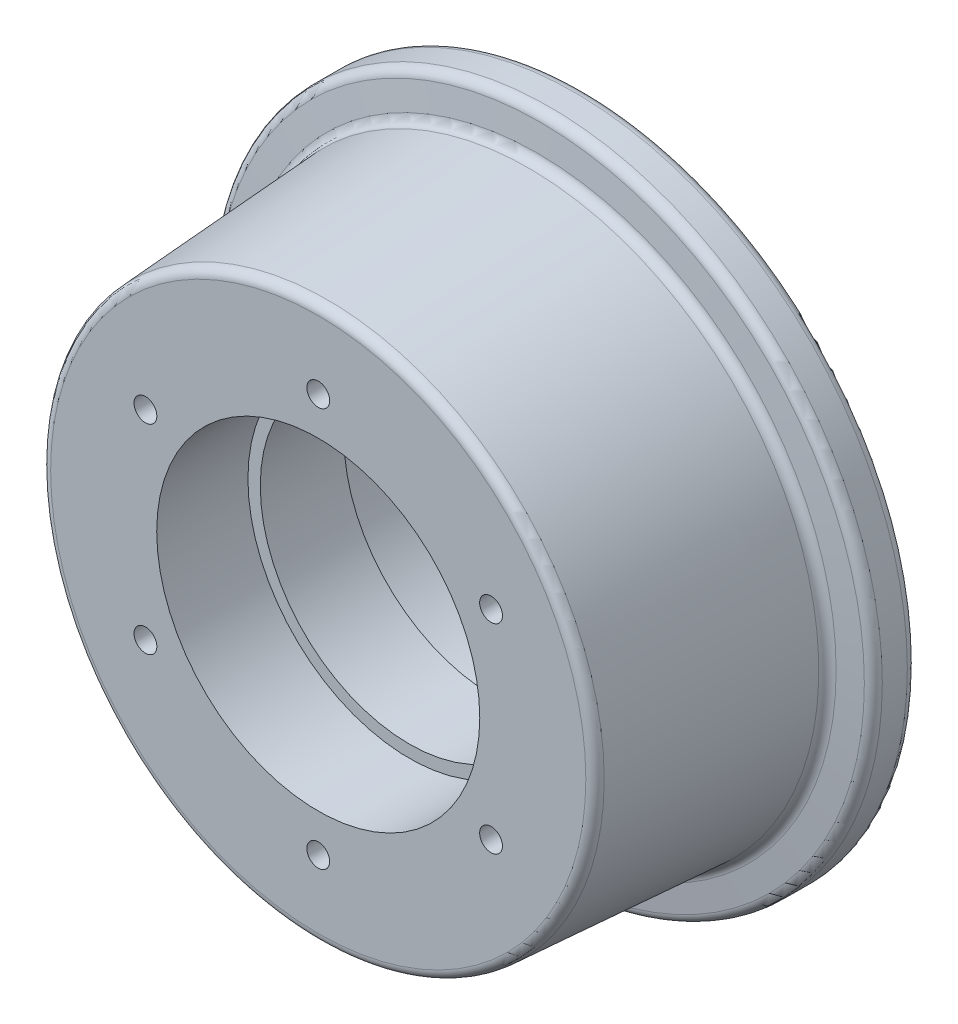
ISO-10303-21;
HEADER;
FILE_DESCRIPTION(('STEP AP214'),'2;1');
FILE_NAME('part.step','',(''),(''),'','','');
FILE_SCHEMA(('AUTOMOTIVE_DESIGN { 1 0 10303 214 1 1 1 1 }'));
ENDSEC;
DATA;
#1=APPLICATION_CONTEXT('core data for automotive mechanical design processes');
#2=APPLICATION_PROTOCOL_DEFINITION('international standard','automotive_design',2000,#1);
#3=PRODUCT_CONTEXT('',#1,'mechanical');
#4=PRODUCT('Part','Part','',(#3));
#5=PRODUCT_RELATED_PRODUCT_CATEGORY('part','',(#4));
#6=PRODUCT_DEFINITION_FORMATION('','',#4);
#7=PRODUCT_DEFINITION_CONTEXT('part definition',#1,'design');
#8=PRODUCT_DEFINITION('design','',#6,#7);
#9=PRODUCT_DEFINITION_SHAPE('','',#8);
#10=(LENGTH_UNIT() NAMED_UNIT(*) SI_UNIT(.MILLI.,.METRE.));
#11=(NAMED_UNIT(*) PLANE_ANGLE_UNIT() SI_UNIT($,.RADIAN.));
#12=(NAMED_UNIT(*) SI_UNIT($,.STERADIAN.) SOLID_ANGLE_UNIT());
#13=UNCERTAINTY_MEASURE_WITH_UNIT(LENGTH_MEASURE(1.E-05),#10,'distance_accuracy_value','');
#14=(GEOMETRIC_REPRESENTATION_CONTEXT(3) GLOBAL_UNCERTAINTY_ASSIGNED_CONTEXT((#13)) GLOBAL_UNIT_ASSIGNED_CONTEXT((#10,
#11,#12)) REPRESENTATION_CONTEXT('',''));
#15=CARTESIAN_POINT('',(0.,0.,0.));
#16=DIRECTION('',(0.,0.,1.));
#17=DIRECTION('',(1.,0.,0.));
#18=AXIS2_PLACEMENT_3D('',#15,#16,#17);
#19=CARTESIAN_POINT('',(0.,78.5,22.));
#20=DIRECTION('',(0.,0.,-1.));
#21=DIRECTION('',(-1.,0.,0.));
#22=AXIS2_PLACEMENT_3D('',#19,#20,#21);
#23=PLANE('',#22);
#24=CARTESIAN_POINT('',(0.,0.,22.));
#25=DIRECTION('',(0.,0.,1.));
#26=DIRECTION('',(1.,0.,0.));
#27=AXIS2_PLACEMENT_3D('',#24,#25,#26);
#28=CIRCLE('',#27,78.5);
#29=CARTESIAN_POINT('',(78.5,0.,22.));
#30=VERTEX_POINT('',#29);
#31=EDGE_CURVE('E64',#30,#30,#28,.T.);
#32=ORIENTED_EDGE('',*,*,#31,.F.);
#33=EDGE_LOOP('',(#32));
#34=FACE_BOUND('',#33,.T.);
#35=CARTESIAN_POINT('',(0.,0.,22.));
#36=DIRECTION('',(0.,0.,1.));
#37=DIRECTION('',(1.,0.,0.));
#38=AXIS2_PLACEMENT_3D('',#35,#36,#37);
#39=CIRCLE('',#38,85.);
#40=CARTESIAN_POINT('',(85.,0.,22.));
#41=VERTEX_POINT('',#40);
#42=EDGE_CURVE('E85',#41,#41,#39,.T.);
#43=ORIENTED_EDGE('',*,*,#42,.T.);
#44=EDGE_LOOP('',(#43));
#45=FACE_BOUND('',#44,.T.);
#46=ADVANCED_FACE('F32',(#34,#45),#23,.F.);
#47=CARTESIAN_POINT('',(0.,0.,1000.));
#48=DIRECTION('',(0.,0.,1.));
#49=DIRECTION('',(1.,0.,0.));
#50=AXIS2_PLACEMENT_3D('',#47,#48,#49);
#51=CYLINDRICAL_SURFACE('',#50,78.5);
#52=CARTESIAN_POINT('',(0.,0.,-22.));
#53=DIRECTION('',(0.,0.,1.));
#54=DIRECTION('',(1.,0.,0.));
#55=AXIS2_PLACEMENT_3D('',#52,#53,#54);
#56=CIRCLE('',#55,78.5);
#57=CARTESIAN_POINT('',(78.5,0.,-22.));
#58=VERTEX_POINT('',#57);
#59=EDGE_CURVE('E67',#58,#58,#56,.T.);
#60=ORIENTED_EDGE('',*,*,#59,.F.);
#61=EDGE_LOOP('',(#60));
#62=FACE_BOUND('',#61,.T.);
#63=ORIENTED_EDGE('',*,*,#31,.T.);
#64=EDGE_LOOP('',(#63));
#65=FACE_BOUND('',#64,.T.);
#66=ADVANCED_FACE('F201',(#62,#65),#51,.F.);
#67=CARTESIAN_POINT('',(0.,78.5,-22.));
#68=DIRECTION('',(0.,0.,1.));
#69=DIRECTION('',(1.,0.,0.));
#70=AXIS2_PLACEMENT_3D('',#67,#68,#69);
#71=PLANE('',#70);
#72=CARTESIAN_POINT('',(0.,0.,-22.));
#73=DIRECTION('',(0.,0.,1.));
#74=DIRECTION('',(1.,0.,0.));
#75=AXIS2_PLACEMENT_3D('',#72,#73,#74);
#76=CIRCLE('',#75,85.);
#77=CARTESIAN_POINT('',(85.,0.,-22.));
#78=VERTEX_POINT('',#77);
#79=EDGE_CURVE('E70',#78,#78,#76,.T.);
#80=ORIENTED_EDGE('',*,*,#79,.F.);
#81=EDGE_LOOP('',(#80));
#82=FACE_BOUND('',#81,.T.);
#83=ORIENTED_EDGE('',*,*,#59,.T.);
#84=EDGE_LOOP('',(#83));
#85=FACE_BOUND('',#84,.T.);
#86=ADVANCED_FACE('F207',(#82,#85),#71,.F.);
#87=CARTESIAN_POINT('',(0.,0.,1000.));
#88=DIRECTION('',(0.,0.,1.));
#89=DIRECTION('',(1.,0.,0.));
#90=AXIS2_PLACEMENT_3D('',#87,#88,#89);
#91=CYLINDRICAL_SURFACE('',#90,85.);
#92=CARTESIAN_POINT('',(0.,0.,-75.));
#93=DIRECTION('',(0.,0.,1.));
#94=DIRECTION('',(1.,0.,0.));
#95=AXIS2_PLACEMENT_3D('',#92,#93,#94);
#96=CIRCLE('',#95,85.);
#97=CARTESIAN_POINT('',(85.,0.,-75.));
#98=VERTEX_POINT('',#97);
#99=EDGE_CURVE('E73',#98,#98,#96,.T.);
#100=ORIENTED_EDGE('',*,*,#99,.F.);
#101=EDGE_LOOP('',(#100));
#102=FACE_BOUND('',#101,.T.);
#103=ORIENTED_EDGE('',*,*,#79,.T.);
#104=EDGE_LOOP('',(#103));
#105=FACE_BOUND('',#104,.T.);
#106=ADVANCED_FACE('F252',(#102,#105),#91,.F.);
#107=CARTESIAN_POINT('',(0.,85.,-75.));
#108=DIRECTION('',(0.,0.,1.));
#109=DIRECTION('',(1.,0.,0.));
#110=AXIS2_PLACEMENT_3D('',#107,#108,#109);
#111=PLANE('',#110);
#112=CARTESIAN_POINT('',(90.9326673973654,52.5000000000011,-75.));
#113=DIRECTION('',(0.,0.,-1.));
#114=DIRECTION('',(-0.50000000000001,0.866025403784433,0.));
#115=AXIS2_PLACEMENT_3D('',#112,#113,#114);
#116=CIRCLE('',#115,6.);
#117=CARTESIAN_POINT('',(87.9326673973654,57.6961524227077,-75.));
#118=VERTEX_POINT('',#117);
#119=EDGE_CURVE('E119',#118,#118,#116,.T.);
#120=ORIENTED_EDGE('',*,*,#119,.F.);
#121=EDGE_LOOP('',(#120));
#122=FACE_BOUND('',#121,.T.);
#123=CARTESIAN_POINT('',(90.9326673973665,-52.4999999999992,-75.));
#124=DIRECTION('',(0.,0.,-1.));
#125=DIRECTION('',(0.499999999999992,0.866025403784443,0.));
#126=AXIS2_PLACEMENT_3D('',#123,#124,#125);
#127=CIRCLE('',#126,6.);
#128=CARTESIAN_POINT('',(93.9326673973665,-47.3038475772925,-75.));
#129=VERTEX_POINT('',#128);
#130=EDGE_CURVE('E113',#129,#129,#127,.T.);
#131=ORIENTED_EDGE('',*,*,#130,.F.);
#132=EDGE_LOOP('',(#131));
#133=FACE_BOUND('',#132,.T.);
#134=CARTESIAN_POINT('',(0.,-105.,-75.));
#135=DIRECTION('',(0.,0.,-1.));
#136=DIRECTION('',(1.,0.,0.));
#137=AXIS2_PLACEMENT_3D('',#134,#135,#136);
#138=CIRCLE('',#137,6.);
#139=CARTESIAN_POINT('',(6.,-105.,-75.));
#140=VERTEX_POINT('',#139);
#141=EDGE_CURVE('E107',#140,#140,#138,.T.);
#142=ORIENTED_EDGE('',*,*,#141,.F.);
#143=EDGE_LOOP('',(#142));
#144=FACE_BOUND('',#143,.T.);
#145=CARTESIAN_POINT('',(-90.9326673973658,-52.5000000000004,-75.));
#146=DIRECTION('',(0.,0.,-1.));
#147=DIRECTION('',(0.500000000000004,-0.866025403784436,0.));
#148=AXIS2_PLACEMENT_3D('',#145,#146,#147);
#149=CIRCLE('',#148,6.);
#150=CARTESIAN_POINT('',(-87.9326673973658,-57.6961524227071,-75.));
#151=VERTEX_POINT('',#150);
#152=EDGE_CURVE('E101',#151,#151,#149,.T.);
#153=ORIENTED_EDGE('',*,*,#152,.F.);
#154=EDGE_LOOP('',(#153));
#155=FACE_BOUND('',#154,.T.);
#156=CARTESIAN_POINT('',(-90.9326673973662,52.4999999999998,-75.));
#157=DIRECTION('',(0.,0.,-1.));
#158=DIRECTION('',(-0.499999999999998,-0.86602540378444,0.));
#159=AXIS2_PLACEMENT_3D('',#156,#157,#158);
#160=CIRCLE('',#159,6.);
#161=CARTESIAN_POINT('',(-93.9326673973662,47.3038475772931,-75.));
#162=VERTEX_POINT('',#161);
#163=EDGE_CURVE('E95',#162,#162,#160,.T.);
#164=ORIENTED_EDGE('',*,*,#163,.F.);
#165=EDGE_LOOP('',(#164));
#166=FACE_BOUND('',#165,.T.);
#167=CARTESIAN_POINT('',(0.,105.,-75.));
#168=DIRECTION('',(0.,0.,-1.));
#169=DIRECTION('',(-1.,0.,0.));
#170=AXIS2_PLACEMENT_3D('',#167,#168,#169);
#171=CIRCLE('',#170,6.);
#172=CARTESIAN_POINT('',(-6.,105.,-75.));
#173=VERTEX_POINT('',#172);
#174=EDGE_CURVE('E89',#173,#173,#171,.T.);
#175=ORIENTED_EDGE('',*,*,#174,.F.);
#176=EDGE_LOOP('',(#175));
#177=FACE_BOUND('',#176,.T.);
#178=CARTESIAN_POINT('',(0.,0.,-75.));
#179=DIRECTION('',(0.,0.,1.));
#180=DIRECTION('',(1.,0.,0.));
#181=AXIS2_PLACEMENT_3D('',#178,#179,#180);
#182=CIRCLE('',#181,140.);
#183=CARTESIAN_POINT('',(140.,0.,-75.));
#184=VERTEX_POINT('',#183);
#185=EDGE_CURVE('E76',#184,#184,#182,.T.);
#186=ORIENTED_EDGE('',*,*,#185,.F.);
#187=EDGE_LOOP('',(#186));
#188=FACE_BOUND('',#187,.T.);
#189=ORIENTED_EDGE('',*,*,#99,.T.);
#190=EDGE_LOOP('',(#189));
#191=FACE_BOUND('',#190,.T.);
#192=ADVANCED_FACE('F248',(#122,#133,#144,#155,#166,#177,#188,#191),#111,.F.);
#193=CARTESIAN_POINT('',(0.,0.,1000.));
#194=DIRECTION('',(0.,0.,1.));
#195=DIRECTION('',(1.,0.,0.));
#196=AXIS2_PLACEMENT_3D('',#193,#194,#195);
#197=CYLINDRICAL_SURFACE('',#196,140.);
#198=CARTESIAN_POINT('',(0.,0.,-69.9999999999998));
#199=DIRECTION('',(0.,0.,1.));
#200=DIRECTION('',(1.,0.,0.));
#201=AXIS2_PLACEMENT_3D('',#198,#199,#200);
#202=CIRCLE('',#201,140.);
#203=CARTESIAN_POINT('',(140.,0.,-69.9999999999998));
#204=VERTEX_POINT('',#203);
#205=EDGE_CURVE('E79',#204,#204,#202,.T.);
#206=ORIENTED_EDGE('',*,*,#205,.F.);
#207=EDGE_LOOP('',(#206));
#208=FACE_BOUND('',#207,.T.);
#209=ORIENTED_EDGE('',*,*,#185,.T.);
#210=EDGE_LOOP('',(#209));
#211=FACE_BOUND('',#210,.T.);
#212=ADVANCED_FACE('F244',(#208,#211),#197,.T.);
#213=CARTESIAN_POINT('',(0.,140.,-69.9999999999999));
#214=DIRECTION('',(0.,0.,1.));
#215=DIRECTION('',(1.,0.,0.));
#216=AXIS2_PLACEMENT_3D('',#213,#214,#215);
#217=PLANE('',#216);
#218=CARTESIAN_POINT('',(0.,0.,-69.9999999999999));
#219=DIRECTION('',(0.,0.,1.));
#220=DIRECTION('',(1.,0.,0.));
#221=AXIS2_PLACEMENT_3D('',#218,#219,#220);
#222=CIRCLE('',#221,170.);
#223=CARTESIAN_POINT('',(170.,0.,-69.9999999999999));
#224=VERTEX_POINT('',#223);
#225=EDGE_CURVE('E55',#224,#224,#222,.F.);
#226=ORIENTED_EDGE('',*,*,#225,.T.);
#227=EDGE_LOOP('',(#226));
#228=FACE_BOUND('',#227,.T.);
#229=ORIENTED_EDGE('',*,*,#205,.T.);
#230=EDGE_LOOP('',(#229));
#231=FACE_BOUND('',#230,.T.);
#232=ADVANCED_FACE('F238',(#228,#231),#217,.F.);
#233=CARTESIAN_POINT('',(0.,0.,1000.));
#234=DIRECTION('',(0.,0.,1.));
#235=DIRECTION('',(1.,0.,0.));
#236=AXIS2_PLACEMENT_3D('',#233,#234,#235);
#237=CYLINDRICAL_SURFACE('',#236,175.);
#238=CARTESIAN_POINT('',(0.,0.,-64.9999999999999));
#239=DIRECTION('',(0.,0.,1.));
#240=DIRECTION('',(1.,0.,0.));
#241=AXIS2_PLACEMENT_3D('',#238,#239,#240);
#242=CIRCLE('',#241,175.);
#243=CARTESIAN_POINT('',(175.,0.,-64.9999999999999));
#244=VERTEX_POINT('',#243);
#245=EDGE_CURVE('E58',#244,#244,#242,.T.);
#246=ORIENTED_EDGE('',*,*,#245,.T.);
#247=EDGE_LOOP('',(#246));
#248=FACE_BOUND('',#247,.T.);
#249=CARTESIAN_POINT('',(0.,0.,-51.8255745653979));
#250=DIRECTION('',(0.,0.,-1.));
#251=DIRECTION('',(-1.,0.,0.));
#252=AXIS2_PLACEMENT_3D('',#249,#250,#251);
#253=CIRCLE('',#252,175.);
#254=CARTESIAN_POINT('',(-175.,0.,-51.8255745653979));
#255=VERTEX_POINT('',#254);
#256=EDGE_CURVE('E61',#255,#255,#253,.T.);
#257=ORIENTED_EDGE('',*,*,#256,.T.);
#258=EDGE_LOOP('',(#257));
#259=FACE_BOUND('',#258,.T.);
#260=ADVANCED_FACE('F230',(#248,#259),#237,.T.);
#261=CARTESIAN_POINT('',(0.,0.,-47.3235543439088));
#262=DIRECTION('',(0.,0.,-1.));
#263=DIRECTION('',(-1.,0.,0.));
#264=AXIS2_PLACEMENT_3D('',#261,#262,#263);
#265=CONICAL_SURFACE('',#264,175.,1.46607657167525);
#266=CARTESIAN_POINT('',(0.,0.,-45.4410556807694));
#267=DIRECTION('',(0.,0.,-1.));
#268=DIRECTION('',(-1.,0.,0.));
#269=AXIS2_PLACEMENT_3D('',#266,#267,#268);
#270=CIRCLE('',#269,157.089221634304);
#271=CARTESIAN_POINT('',(-157.089221634304,0.,-45.4410556807694));
#272=VERTEX_POINT('',#271);
#273=EDGE_CURVE('E39',#272,#272,#270,.T.);
#274=ORIENTED_EDGE('',*,*,#273,.T.);
#275=EDGE_LOOP('',(#274));
#276=FACE_BOUND('',#275,.T.);
#277=CARTESIAN_POINT('',(0.,0.,-46.8529650885566));
#278=DIRECTION('',(0.,0.,1.));
#279=DIRECTION('',(1.,0.,0.));
#280=AXIS2_PLACEMENT_3D('',#277,#278,#279);
#281=CIRCLE('',#280,170.522642316338);
#282=CARTESIAN_POINT('',(170.522642316338,0.,-46.8529650885566));
#283=VERTEX_POINT('',#282);
#284=EDGE_CURVE('E43',#283,#283,#281,.T.);
#285=ORIENTED_EDGE('',*,*,#284,.T.);
#286=EDGE_LOOP('',(#285));
#287=FACE_BOUND('',#286,.T.);
#288=ADVANCED_FACE('F228',(#276,#287),#265,.T.);
#289=CARTESIAN_POINT('',(0.,0.,-44.9999999999999));
#290=DIRECTION('',(0.,0.,-1.));
#291=DIRECTION('',(-1.,0.,0.));
#292=AXIS2_PLACEMENT_3D('',#289,#290,#291);
#293=CONICAL_SURFACE('',#292,152.892857142857,0.064197376373133);
#294=CARTESIAN_POINT('',(0.,0.,-40.7892126505157));
#295=DIRECTION('',(0.,0.,-1.));
#296=DIRECTION('',(-1.,0.,0.));
#297=AXIS2_PLACEMENT_3D('',#294,#295,#296);
#298=CIRCLE('',#297,152.62216367039);
#299=CARTESIAN_POINT('',(-152.62216367039,0.,-40.7892126505157));
#300=VERTEX_POINT('',#299);
#301=EDGE_CURVE('E47',#300,#300,#298,.F.);
#302=ORIENTED_EDGE('',*,*,#301,.T.);
#303=EDGE_LOOP('',(#302));
#304=FACE_BOUND('',#303,.T.);
#305=CARTESIAN_POINT('',(0.,0.,65.3207664465874));
#306=DIRECTION('',(0.,0.,1.));
#307=DIRECTION('',(1.,0.,0.));
#308=AXIS2_PLACEMENT_3D('',#305,#306,#307);
#309=CIRCLE('',#308,145.800807871291);
#310=CARTESIAN_POINT('',(145.800807871291,0.,65.3207664465874));
#311=VERTEX_POINT('',#310);
#312=EDGE_CURVE('E52',#311,#311,#309,.F.);
#313=ORIENTED_EDGE('',*,*,#312,.T.);
#314=EDGE_LOOP('',(#313));
#315=FACE_BOUND('',#314,.T.);
#316=ADVANCED_FACE('F174',(#304,#315),#293,.T.);
#317=CARTESIAN_POINT('',(0.,85.,70.));
#318=DIRECTION('',(0.,0.,-1.));
#319=DIRECTION('',(-1.,0.,0.));
#320=AXIS2_PLACEMENT_3D('',#317,#318,#319);
#321=PLANE('',#320);
#322=CARTESIAN_POINT('',(90.9326673973654,52.5000000000011,70.));
#323=DIRECTION('',(0.,0.,1.));
#324=DIRECTION('',(0.50000000000001,-0.866025403784433,0.));
#325=AXIS2_PLACEMENT_3D('',#322,#323,#324);
#326=CIRCLE('',#325,6.);
#327=CARTESIAN_POINT('',(93.9326673973655,47.3038475772945,70.));
#328=VERTEX_POINT('',#327);
#329=EDGE_CURVE('E155',#328,#328,#326,.T.);
#330=ORIENTED_EDGE('',*,*,#329,.F.);
#331=EDGE_LOOP('',(#330));
#332=FACE_BOUND('',#331,.T.);
#333=CARTESIAN_POINT('',(90.9326673973665,-52.4999999999992,70.));
#334=DIRECTION('',(0.,0.,1.));
#335=DIRECTION('',(-0.499999999999992,-0.866025403784443,0.));
#336=AXIS2_PLACEMENT_3D('',#333,#334,#335);
#337=CIRCLE('',#336,6.);
#338=CARTESIAN_POINT('',(87.9326673973666,-57.6961524227058,70.));
#339=VERTEX_POINT('',#338);
#340=EDGE_CURVE('E149',#339,#339,#337,.T.);
#341=ORIENTED_EDGE('',*,*,#340,.F.);
#342=EDGE_LOOP('',(#341));
#343=FACE_BOUND('',#342,.T.);
#344=CARTESIAN_POINT('',(0.,-105.,70.));
#345=DIRECTION('',(0.,0.,1.));
#346=DIRECTION('',(-1.,0.,0.));
#347=AXIS2_PLACEMENT_3D('',#344,#345,#346);
#348=CIRCLE('',#347,6.);
#349=CARTESIAN_POINT('',(-6.,-105.,70.));
#350=VERTEX_POINT('',#349);
#351=EDGE_CURVE('E143',#350,#350,#348,.T.);
#352=ORIENTED_EDGE('',*,*,#351,.F.);
#353=EDGE_LOOP('',(#352));
#354=FACE_BOUND('',#353,.T.);
#355=CARTESIAN_POINT('',(-90.9326673973658,-52.5000000000004,70.));
#356=DIRECTION('',(0.,0.,1.));
#357=DIRECTION('',(-0.500000000000004,0.866025403784436,0.));
#358=AXIS2_PLACEMENT_3D('',#355,#356,#357);
#359=CIRCLE('',#358,6.);
#360=CARTESIAN_POINT('',(-93.9326673973659,-47.3038475772938,70.));
#361=VERTEX_POINT('',#360);
#362=EDGE_CURVE('E137',#361,#361,#359,.T.);
#363=ORIENTED_EDGE('',*,*,#362,.F.);
#364=EDGE_LOOP('',(#363));
#365=FACE_BOUND('',#364,.T.);
#366=CARTESIAN_POINT('',(-90.9326673973662,52.4999999999998,70.));
#367=DIRECTION('',(0.,0.,1.));
#368=DIRECTION('',(0.499999999999998,0.86602540378444,0.));
#369=AXIS2_PLACEMENT_3D('',#366,#367,#368);
#370=CIRCLE('',#369,6.);
#371=CARTESIAN_POINT('',(-87.9326673973662,57.6961524227064,70.));
#372=VERTEX_POINT('',#371);
#373=EDGE_CURVE('E131',#372,#372,#370,.T.);
#374=ORIENTED_EDGE('',*,*,#373,.F.);
#375=EDGE_LOOP('',(#374));
#376=FACE_BOUND('',#375,.T.);
#377=CARTESIAN_POINT('',(0.,105.,70.));
#378=DIRECTION('',(0.,0.,1.));
#379=DIRECTION('',(1.,0.,0.));
#380=AXIS2_PLACEMENT_3D('',#377,#378,#379);
#381=CIRCLE('',#380,6.);
#382=CARTESIAN_POINT('',(6.,105.,70.));
#383=VERTEX_POINT('',#382);
#384=EDGE_CURVE('E125',#383,#383,#381,.T.);
#385=ORIENTED_EDGE('',*,*,#384,.F.);
#386=EDGE_LOOP('',(#385));
#387=FACE_BOUND('',#386,.T.);
#388=CARTESIAN_POINT('',(0.,0.,70.));
#389=DIRECTION('',(0.,0.,-1.));
#390=DIRECTION('',(-1.,0.,0.));
#391=AXIS2_PLACEMENT_3D('',#388,#389,#390);
#392=CIRCLE('',#391,140.811107591039);
#393=CARTESIAN_POINT('',(-140.811107591039,0.,70.));
#394=VERTEX_POINT('',#393);
#395=EDGE_CURVE('E10',#394,#394,#392,.F.);
#396=ORIENTED_EDGE('',*,*,#395,.T.);
#397=EDGE_LOOP('',(#396));
#398=FACE_BOUND('',#397,.T.);
#399=CARTESIAN_POINT('',(0.,0.,70.0000000000001));
#400=DIRECTION('',(0.,0.,1.));
#401=DIRECTION('',(1.,0.,0.));
#402=AXIS2_PLACEMENT_3D('',#399,#400,#401);
#403=CIRCLE('',#402,85.);
#404=CARTESIAN_POINT('',(85.,0.,70.0000000000001));
#405=VERTEX_POINT('',#404);
#406=EDGE_CURVE('E82',#405,#405,#403,.T.);
#407=ORIENTED_EDGE('',*,*,#406,.F.);
#408=EDGE_LOOP('',(#407));
#409=FACE_BOUND('',#408,.T.);
#410=ADVANCED_FACE('F170',(#332,#343,#354,#365,#376,#387,#398,#409),#321,.F.);
#411=CARTESIAN_POINT('',(0.,0.,1000.));
#412=DIRECTION('',(0.,0.,1.));
#413=DIRECTION('',(1.,0.,0.));
#414=AXIS2_PLACEMENT_3D('',#411,#412,#413);
#415=CYLINDRICAL_SURFACE('',#414,85.);
#416=ORIENTED_EDGE('',*,*,#42,.F.);
#417=EDGE_LOOP('',(#416));
#418=FACE_BOUND('',#417,.T.);
#419=ORIENTED_EDGE('',*,*,#406,.T.);
#420=EDGE_LOOP('',(#419));
#421=FACE_BOUND('',#420,.T.);
#422=ADVANCED_FACE('F173',(#418,#421),#415,.F.);
#423=CARTESIAN_POINT('',(0.,0.,-64.9999999999999));
#424=DIRECTION('',(0.,0.,1.));
#425=DIRECTION('',(1.,0.,0.));
#426=AXIS2_PLACEMENT_3D('',#423,#424,#425);
#427=TOROIDAL_SURFACE('',#426,170.,5.);
#428=ORIENTED_EDGE('',*,*,#225,.F.);
#429=EDGE_LOOP('',(#428));
#430=FACE_BOUND('',#429,.T.);
#431=ORIENTED_EDGE('',*,*,#245,.F.);
#432=EDGE_LOOP('',(#431));
#433=FACE_BOUND('',#432,.T.);
#434=ADVANCED_FACE('F189',(#430,#433),#427,.T.);
#435=CARTESIAN_POINT('',(0.,0.,-40.468446203928));
#436=DIRECTION('',(0.,0.,1.));
#437=DIRECTION('',(1.,0.,0.));
#438=AXIS2_PLACEMENT_3D('',#435,#436,#437);
#439=TOROIDAL_SURFACE('',#438,157.611863950642,5.);
#440=ORIENTED_EDGE('',*,*,#273,.F.);
#441=EDGE_LOOP('',(#440));
#442=FACE_BOUND('',#441,.T.);
#443=ORIENTED_EDGE('',*,*,#301,.F.);
#444=EDGE_LOOP('',(#443));
#445=FACE_BOUND('',#444,.T.);
#446=ADVANCED_FACE('F195',(#442,#445),#439,.F.);
#447=CARTESIAN_POINT('',(0.,0.,-51.8255745653979));
#448=DIRECTION('',(0.,0.,-1.));
#449=DIRECTION('',(-1.,0.,0.));
#450=AXIS2_PLACEMENT_3D('',#447,#448,#449);
#451=TOROIDAL_SURFACE('',#450,170.,5.);
#452=ORIENTED_EDGE('',*,*,#256,.F.);
#453=EDGE_LOOP('',(#452));
#454=FACE_BOUND('',#453,.T.);
#455=ORIENTED_EDGE('',*,*,#284,.F.);
#456=EDGE_LOOP('',(#455));
#457=FACE_BOUND('',#456,.T.);
#458=ADVANCED_FACE('F215',(#454,#457),#451,.T.);
#459=CARTESIAN_POINT('',(0.,0.,65.));
#460=DIRECTION('',(0.,0.,-1.));
#461=DIRECTION('',(-1.,0.,0.));
#462=AXIS2_PLACEMENT_3D('',#459,#460,#461);
#463=TOROIDAL_SURFACE('',#462,140.811107591039,5.);
#464=ORIENTED_EDGE('',*,*,#312,.F.);
#465=EDGE_LOOP('',(#464));
#466=FACE_BOUND('',#465,.T.);
#467=ORIENTED_EDGE('',*,*,#395,.F.);
#468=EDGE_LOOP('',(#467));
#469=FACE_BOUND('',#468,.T.);
#470=ADVANCED_FACE('F34',(#466,#469),#463,.T.);
#471=CARTESIAN_POINT('',(0.,105.,-50.));
#472=DIRECTION('',(0.,0.,-1.));
#473=DIRECTION('',(-1.,0.,0.));
#474=AXIS2_PLACEMENT_3D('',#471,#472,#473);
#475=CYLINDRICAL_SURFACE('',#474,6.);
#476=CARTESIAN_POINT('',(0.,105.,-50.));
#477=DIRECTION('',(0.,0.,-1.));
#478=DIRECTION('',(-1.,0.,0.));
#479=AXIS2_PLACEMENT_3D('',#476,#477,#478);
#480=CIRCLE('',#479,6.);
#481=CARTESIAN_POINT('',(-6.,105.,-50.));
#482=VERTEX_POINT('',#481);
#483=EDGE_CURVE('E88',#482,#482,#480,.T.);
#484=ORIENTED_EDGE('',*,*,#483,.F.);
#485=EDGE_LOOP('',(#484));
#486=FACE_BOUND('',#485,.T.);
#487=ORIENTED_EDGE('',*,*,#174,.T.);
#488=EDGE_LOOP('',(#487));
#489=FACE_BOUND('',#488,.T.);
#490=ADVANCED_FACE('F222',(#486,#489),#475,.F.);
#491=CARTESIAN_POINT('',(0.,105.,-50.));
#492=DIRECTION('',(0.,0.,-1.));
#493=DIRECTION('',(-1.,0.,0.));
#494=AXIS2_PLACEMENT_3D('',#491,#492,#493);
#495=PLANE('',#494);
#496=ORIENTED_EDGE('',*,*,#483,.T.);
#497=EDGE_LOOP('',(#496));
#498=FACE_BOUND('',#497,.T.);
#499=ADVANCED_FACE('F331',(#498),#495,.T.);
#500=CARTESIAN_POINT('',(-90.9326673973662,52.4999999999998,-50.));
#501=DIRECTION('',(0.,0.,-1.));
#502=DIRECTION('',(-1.,0.,0.));
#503=AXIS2_PLACEMENT_3D('',#500,#501,#502);
#504=CYLINDRICAL_SURFACE('',#503,6.);
#505=CARTESIAN_POINT('',(-90.9326673973662,52.4999999999998,-50.));
#506=DIRECTION('',(0.,0.,-1.));
#507=DIRECTION('',(-0.499999999999998,-0.86602540378444,0.));
#508=AXIS2_PLACEMENT_3D('',#505,#506,#507);
#509=CIRCLE('',#508,6.);
#510=CARTESIAN_POINT('',(-93.9326673973662,47.3038475772931,-50.));
#511=VERTEX_POINT('',#510);
#512=EDGE_CURVE('E92',#511,#511,#509,.T.);
#513=ORIENTED_EDGE('',*,*,#512,.F.);
#514=EDGE_LOOP('',(#513));
#515=FACE_BOUND('',#514,.T.);
#516=ORIENTED_EDGE('',*,*,#163,.T.);
#517=EDGE_LOOP('',(#516));
#518=FACE_BOUND('',#517,.T.);
#519=ADVANCED_FACE('F339',(#515,#518),#504,.F.);
#520=CARTESIAN_POINT('',(-90.9326673973662,52.4999999999998,-50.));
#521=DIRECTION('',(0.,0.,-1.));
#522=DIRECTION('',(-0.499999999999998,-0.86602540378444,0.));
#523=AXIS2_PLACEMENT_3D('',#520,#521,#522);
#524=PLANE('',#523);
#525=ORIENTED_EDGE('',*,*,#512,.T.);
#526=EDGE_LOOP('',(#525));
#527=FACE_BOUND('',#526,.T.);
#528=ADVANCED_FACE('F349',(#527),#524,.T.);
#529=CARTESIAN_POINT('',(-90.9326673973658,-52.5000000000004,-50.));
#530=DIRECTION('',(0.,0.,-1.));
#531=DIRECTION('',(-1.,0.,0.));
#532=AXIS2_PLACEMENT_3D('',#529,#530,#531);
#533=CYLINDRICAL_SURFACE('',#532,6.);
#534=CARTESIAN_POINT('',(-90.9326673973658,-52.5000000000004,-50.));
#535=DIRECTION('',(0.,0.,-1.));
#536=DIRECTION('',(0.500000000000004,-0.866025403784436,0.));
#537=AXIS2_PLACEMENT_3D('',#534,#535,#536);
#538=CIRCLE('',#537,6.);
#539=CARTESIAN_POINT('',(-87.9326673973658,-57.6961524227071,-50.));
#540=VERTEX_POINT('',#539);
#541=EDGE_CURVE('E98',#540,#540,#538,.T.);
#542=ORIENTED_EDGE('',*,*,#541,.F.);
#543=EDGE_LOOP('',(#542));
#544=FACE_BOUND('',#543,.T.);
#545=ORIENTED_EDGE('',*,*,#152,.T.);
#546=EDGE_LOOP('',(#545));
#547=FACE_BOUND('',#546,.T.);
#548=ADVANCED_FACE('F356',(#544,#547),#533,.F.);
#549=CARTESIAN_POINT('',(-90.9326673973658,-52.5000000000004,-50.));
#550=DIRECTION('',(0.,0.,-1.));
#551=DIRECTION('',(0.500000000000004,-0.866025403784436,0.));
#552=AXIS2_PLACEMENT_3D('',#549,#550,#551);
#553=PLANE('',#552);
#554=ORIENTED_EDGE('',*,*,#541,.T.);
#555=EDGE_LOOP('',(#554));
#556=FACE_BOUND('',#555,.T.);
#557=ADVANCED_FACE('F364',(#556),#553,.T.);
#558=CARTESIAN_POINT('',(0.,-105.,-50.));
#559=DIRECTION('',(0.,0.,-1.));
#560=DIRECTION('',(-1.,0.,0.));
#561=AXIS2_PLACEMENT_3D('',#558,#559,#560);
#562=CYLINDRICAL_SURFACE('',#561,6.);
#563=CARTESIAN_POINT('',(0.,-105.,-50.));
#564=DIRECTION('',(0.,0.,-1.));
#565=DIRECTION('',(1.,0.,0.));
#566=AXIS2_PLACEMENT_3D('',#563,#564,#565);
#567=CIRCLE('',#566,6.);
#568=CARTESIAN_POINT('',(6.,-105.,-50.));
#569=VERTEX_POINT('',#568);
#570=EDGE_CURVE('E104',#569,#569,#567,.T.);
#571=ORIENTED_EDGE('',*,*,#570,.F.);
#572=EDGE_LOOP('',(#571));
#573=FACE_BOUND('',#572,.T.);
#574=ORIENTED_EDGE('',*,*,#141,.T.);
#575=EDGE_LOOP('',(#574));
#576=FACE_BOUND('',#575,.T.);
#577=ADVANCED_FACE('F372',(#573,#576),#562,.F.);
#578=CARTESIAN_POINT('',(0.,-105.,-50.));
#579=DIRECTION('',(0.,0.,-1.));
#580=DIRECTION('',(1.,0.,0.));
#581=AXIS2_PLACEMENT_3D('',#578,#579,#580);
#582=PLANE('',#581);
#583=ORIENTED_EDGE('',*,*,#570,.T.);
#584=EDGE_LOOP('',(#583));
#585=FACE_BOUND('',#584,.T.);
#586=ADVANCED_FACE('F380',(#585),#582,.T.);
#587=CARTESIAN_POINT('',(90.9326673973665,-52.4999999999992,-50.));
#588=DIRECTION('',(0.,0.,-1.));
#589=DIRECTION('',(-1.,0.,0.));
#590=AXIS2_PLACEMENT_3D('',#587,#588,#589);
#591=CYLINDRICAL_SURFACE('',#590,6.);
#592=CARTESIAN_POINT('',(90.9326673973665,-52.4999999999992,-50.));
#593=DIRECTION('',(0.,0.,-1.));
#594=DIRECTION('',(0.499999999999992,0.866025403784443,0.));
#595=AXIS2_PLACEMENT_3D('',#592,#593,#594);
#596=CIRCLE('',#595,6.);
#597=CARTESIAN_POINT('',(93.9326673973665,-47.3038475772925,-50.));
#598=VERTEX_POINT('',#597);
#599=EDGE_CURVE('E110',#598,#598,#596,.T.);
#600=ORIENTED_EDGE('',*,*,#599,.F.);
#601=EDGE_LOOP('',(#600));
#602=FACE_BOUND('',#601,.T.);
#603=ORIENTED_EDGE('',*,*,#130,.T.);
#604=EDGE_LOOP('',(#603));
#605=FACE_BOUND('',#604,.T.);
#606=ADVANCED_FACE('F388',(#602,#605),#591,.F.);
#607=CARTESIAN_POINT('',(90.9326673973665,-52.4999999999992,-50.));
#608=DIRECTION('',(0.,0.,-1.));
#609=DIRECTION('',(0.499999999999992,0.866025403784443,0.));
#610=AXIS2_PLACEMENT_3D('',#607,#608,#609);
#611=PLANE('',#610);
#612=ORIENTED_EDGE('',*,*,#599,.T.);
#613=EDGE_LOOP('',(#612));
#614=FACE_BOUND('',#613,.T.);
#615=ADVANCED_FACE('F396',(#614),#611,.T.);
#616=CARTESIAN_POINT('',(90.9326673973654,52.5000000000011,-50.));
#617=DIRECTION('',(0.,0.,-1.));
#618=DIRECTION('',(-1.,0.,0.));
#619=AXIS2_PLACEMENT_3D('',#616,#617,#618);
#620=CYLINDRICAL_SURFACE('',#619,6.);
#621=CARTESIAN_POINT('',(90.9326673973654,52.5000000000011,-50.));
#622=DIRECTION('',(0.,0.,-1.));
#623=DIRECTION('',(-0.50000000000001,0.866025403784433,0.));
#624=AXIS2_PLACEMENT_3D('',#621,#622,#623);
#625=CIRCLE('',#624,6.);
#626=CARTESIAN_POINT('',(87.9326673973654,57.6961524227077,-50.));
#627=VERTEX_POINT('',#626);
#628=EDGE_CURVE('E116',#627,#627,#625,.T.);
#629=ORIENTED_EDGE('',*,*,#628,.F.);
#630=EDGE_LOOP('',(#629));
#631=FACE_BOUND('',#630,.T.);
#632=ORIENTED_EDGE('',*,*,#119,.T.);
#633=EDGE_LOOP('',(#632));
#634=FACE_BOUND('',#633,.T.);
#635=ADVANCED_FACE('F404',(#631,#634),#620,.F.);
#636=CARTESIAN_POINT('',(90.9326673973654,52.5000000000011,-50.));
#637=DIRECTION('',(0.,0.,-1.));
#638=DIRECTION('',(-0.50000000000001,0.866025403784433,0.));
#639=AXIS2_PLACEMENT_3D('',#636,#637,#638);
#640=PLANE('',#639);
#641=ORIENTED_EDGE('',*,*,#628,.T.);
#642=EDGE_LOOP('',(#641));
#643=FACE_BOUND('',#642,.T.);
#644=ADVANCED_FACE('F412',(#643),#640,.T.);
#645=CARTESIAN_POINT('',(0.,105.,45.));
#646=DIRECTION('',(0.,0.,1.));
#647=DIRECTION('',(1.,0.,0.));
#648=AXIS2_PLACEMENT_3D('',#645,#646,#647);
#649=CYLINDRICAL_SURFACE('',#648,6.);
#650=CARTESIAN_POINT('',(0.,105.,45.));
#651=DIRECTION('',(0.,0.,1.));
#652=DIRECTION('',(1.,0.,0.));
#653=AXIS2_PLACEMENT_3D('',#650,#651,#652);
#654=CIRCLE('',#653,6.);
#655=CARTESIAN_POINT('',(6.,105.,45.));
#656=VERTEX_POINT('',#655);
#657=EDGE_CURVE('E122',#656,#656,#654,.T.);
#658=ORIENTED_EDGE('',*,*,#657,.F.);
#659=EDGE_LOOP('',(#658));
#660=FACE_BOUND('',#659,.T.);
#661=ORIENTED_EDGE('',*,*,#384,.T.);
#662=EDGE_LOOP('',(#661));
#663=FACE_BOUND('',#662,.T.);
#664=ADVANCED_FACE('F420',(#660,#663),#649,.F.);
#665=CARTESIAN_POINT('',(0.,105.,45.));
#666=DIRECTION('',(0.,0.,1.));
#667=DIRECTION('',(1.,0.,0.));
#668=AXIS2_PLACEMENT_3D('',#665,#666,#667);
#669=PLANE('',#668);
#670=ORIENTED_EDGE('',*,*,#657,.T.);
#671=EDGE_LOOP('',(#670));
#672=FACE_BOUND('',#671,.T.);
#673=ADVANCED_FACE('F428',(#672),#669,.T.);
#674=CARTESIAN_POINT('',(-90.9326673973662,52.4999999999998,45.));
#675=DIRECTION('',(0.,0.,1.));
#676=DIRECTION('',(1.,0.,0.));
#677=AXIS2_PLACEMENT_3D('',#674,#675,#676);
#678=CYLINDRICAL_SURFACE('',#677,6.);
#679=CARTESIAN_POINT('',(-90.9326673973662,52.4999999999998,45.));
#680=DIRECTION('',(0.,0.,1.));
#681=DIRECTION('',(0.499999999999998,0.86602540378444,0.));
#682=AXIS2_PLACEMENT_3D('',#679,#680,#681);
#683=CIRCLE('',#682,6.);
#684=CARTESIAN_POINT('',(-87.9326673973662,57.6961524227064,45.));
#685=VERTEX_POINT('',#684);
#686=EDGE_CURVE('E128',#685,#685,#683,.T.);
#687=ORIENTED_EDGE('',*,*,#686,.F.);
#688=EDGE_LOOP('',(#687));
#689=FACE_BOUND('',#688,.T.);
#690=ORIENTED_EDGE('',*,*,#373,.T.);
#691=EDGE_LOOP('',(#690));
#692=FACE_BOUND('',#691,.T.);
#693=ADVANCED_FACE('F436',(#689,#692),#678,.F.);
#694=CARTESIAN_POINT('',(-90.9326673973662,52.4999999999998,45.));
#695=DIRECTION('',(0.,0.,1.));
#696=DIRECTION('',(0.499999999999998,0.86602540378444,0.));
#697=AXIS2_PLACEMENT_3D('',#694,#695,#696);
#698=PLANE('',#697);
#699=ORIENTED_EDGE('',*,*,#686,.T.);
#700=EDGE_LOOP('',(#699));
#701=FACE_BOUND('',#700,.T.);
#702=ADVANCED_FACE('F445',(#701),#698,.T.);
#703=CARTESIAN_POINT('',(-90.9326673973658,-52.5000000000004,45.));
#704=DIRECTION('',(0.,0.,1.));
#705=DIRECTION('',(1.,0.,0.));
#706=AXIS2_PLACEMENT_3D('',#703,#704,#705);
#707=CYLINDRICAL_SURFACE('',#706,6.);
#708=CARTESIAN_POINT('',(-90.9326673973658,-52.5000000000004,45.));
#709=DIRECTION('',(0.,0.,1.));
#710=DIRECTION('',(-0.500000000000004,0.866025403784436,0.));
#711=AXIS2_PLACEMENT_3D('',#708,#709,#710);
#712=CIRCLE('',#711,6.);
#713=CARTESIAN_POINT('',(-93.9326673973659,-47.3038475772938,45.));
#714=VERTEX_POINT('',#713);
#715=EDGE_CURVE('E134',#714,#714,#712,.T.);
#716=ORIENTED_EDGE('',*,*,#715,.F.);
#717=EDGE_LOOP('',(#716));
#718=FACE_BOUND('',#717,.T.);
#719=ORIENTED_EDGE('',*,*,#362,.T.);
#720=EDGE_LOOP('',(#719));
#721=FACE_BOUND('',#720,.T.);
#722=ADVANCED_FACE('F453',(#718,#721),#707,.F.);
#723=CARTESIAN_POINT('',(-90.9326673973658,-52.5000000000004,45.));
#724=DIRECTION('',(0.,0.,1.));
#725=DIRECTION('',(-0.500000000000004,0.866025403784436,0.));
#726=AXIS2_PLACEMENT_3D('',#723,#724,#725);
#727=PLANE('',#726);
#728=ORIENTED_EDGE('',*,*,#715,.T.);
#729=EDGE_LOOP('',(#728));
#730=FACE_BOUND('',#729,.T.);
#731=ADVANCED_FACE('F461',(#730),#727,.T.);
#732=CARTESIAN_POINT('',(0.,-105.,45.));
#733=DIRECTION('',(0.,0.,1.));
#734=DIRECTION('',(1.,0.,0.));
#735=AXIS2_PLACEMENT_3D('',#732,#733,#734);
#736=CYLINDRICAL_SURFACE('',#735,6.);
#737=CARTESIAN_POINT('',(0.,-105.,45.));
#738=DIRECTION('',(0.,0.,1.));
#739=DIRECTION('',(-1.,0.,0.));
#740=AXIS2_PLACEMENT_3D('',#737,#738,#739);
#741=CIRCLE('',#740,6.);
#742=CARTESIAN_POINT('',(-6.,-105.,45.));
#743=VERTEX_POINT('',#742);
#744=EDGE_CURVE('E140',#743,#743,#741,.T.);
#745=ORIENTED_EDGE('',*,*,#744,.F.);
#746=EDGE_LOOP('',(#745));
#747=FACE_BOUND('',#746,.T.);
#748=ORIENTED_EDGE('',*,*,#351,.T.);
#749=EDGE_LOOP('',(#748));
#750=FACE_BOUND('',#749,.T.);
#751=ADVANCED_FACE('F469',(#747,#750),#736,.F.);
#752=CARTESIAN_POINT('',(0.,-105.,45.));
#753=DIRECTION('',(0.,0.,1.));
#754=DIRECTION('',(-1.,0.,0.));
#755=AXIS2_PLACEMENT_3D('',#752,#753,#754);
#756=PLANE('',#755);
#757=ORIENTED_EDGE('',*,*,#744,.T.);
#758=EDGE_LOOP('',(#757));
#759=FACE_BOUND('',#758,.T.);
#760=ADVANCED_FACE('F477',(#759),#756,.T.);
#761=CARTESIAN_POINT('',(90.9326673973665,-52.4999999999992,45.));
#762=DIRECTION('',(0.,0.,1.));
#763=DIRECTION('',(1.,0.,0.));
#764=AXIS2_PLACEMENT_3D('',#761,#762,#763);
#765=CYLINDRICAL_SURFACE('',#764,6.);
#766=CARTESIAN_POINT('',(90.9326673973665,-52.4999999999992,45.));
#767=DIRECTION('',(0.,0.,1.));
#768=DIRECTION('',(-0.499999999999992,-0.866025403784443,0.));
#769=AXIS2_PLACEMENT_3D('',#766,#767,#768);
#770=CIRCLE('',#769,6.);
#771=CARTESIAN_POINT('',(87.9326673973666,-57.6961524227058,45.));
#772=VERTEX_POINT('',#771);
#773=EDGE_CURVE('E146',#772,#772,#770,.T.);
#774=ORIENTED_EDGE('',*,*,#773,.F.);
#775=EDGE_LOOP('',(#774));
#776=FACE_BOUND('',#775,.T.);
#777=ORIENTED_EDGE('',*,*,#340,.T.);
#778=EDGE_LOOP('',(#777));
#779=FACE_BOUND('',#778,.T.);
#780=ADVANCED_FACE('F485',(#776,#779),#765,.F.);
#781=CARTESIAN_POINT('',(90.9326673973665,-52.4999999999992,45.));
#782=DIRECTION('',(0.,0.,1.));
#783=DIRECTION('',(-0.499999999999992,-0.866025403784443,0.));
#784=AXIS2_PLACEMENT_3D('',#781,#782,#783);
#785=PLANE('',#784);
#786=ORIENTED_EDGE('',*,*,#773,.T.);
#787=EDGE_LOOP('',(#786));
#788=FACE_BOUND('',#787,.T.);
#789=ADVANCED_FACE('F166',(#788),#785,.T.);
#790=CARTESIAN_POINT('',(90.9326673973654,52.5000000000011,45.));
#791=DIRECTION('',(0.,0.,1.));
#792=DIRECTION('',(1.,0.,0.));
#793=AXIS2_PLACEMENT_3D('',#790,#791,#792);
#794=CYLINDRICAL_SURFACE('',#793,6.);
#795=CARTESIAN_POINT('',(90.9326673973654,52.5000000000011,45.));
#796=DIRECTION('',(0.,0.,1.));
#797=DIRECTION('',(0.50000000000001,-0.866025403784433,0.));
#798=AXIS2_PLACEMENT_3D('',#795,#796,#797);
#799=CIRCLE('',#798,6.);
#800=CARTESIAN_POINT('',(93.9326673973655,47.3038475772945,45.));
#801=VERTEX_POINT('',#800);
#802=EDGE_CURVE('E152',#801,#801,#799,.T.);
#803=ORIENTED_EDGE('',*,*,#802,.F.);
#804=EDGE_LOOP('',(#803));
#805=FACE_BOUND('',#804,.T.);
#806=ORIENTED_EDGE('',*,*,#329,.T.);
#807=EDGE_LOOP('',(#806));
#808=FACE_BOUND('',#807,.T.);
#809=ADVANCED_FACE('F163',(#805,#808),#794,.F.);
#810=CARTESIAN_POINT('',(90.9326673973654,52.5000000000011,45.));
#811=DIRECTION('',(0.,0.,1.));
#812=DIRECTION('',(0.50000000000001,-0.866025403784433,0.));
#813=AXIS2_PLACEMENT_3D('',#810,#811,#812);
#814=PLANE('',#813);
#815=ORIENTED_EDGE('',*,*,#802,.T.);
#816=EDGE_LOOP('',(#815));
#817=FACE_BOUND('',#816,.T.);
#818=ADVANCED_FACE('F161',(#817),#814,.T.);
#819=CLOSED_SHELL('',(#46,#66,#86,#106,#192,#212,#232,#260,#288,#316,#410,#422,#434,#446,#458,
#470,#490,#499,#519,#528,#548,#557,#577,#586,#606,#615,#635,#644,#664,#673,#693,#702,#722,#731,
#751,#760,#780,#789,#809,#818));
#820=MANIFOLD_SOLID_BREP('B2',#819);
#821=ADVANCED_BREP_SHAPE_REPRESENTATION('',(#18,#820),#14);
#822=SHAPE_DEFINITION_REPRESENTATION(#9,#821);
ENDSEC;
END-ISO-10303-21;
